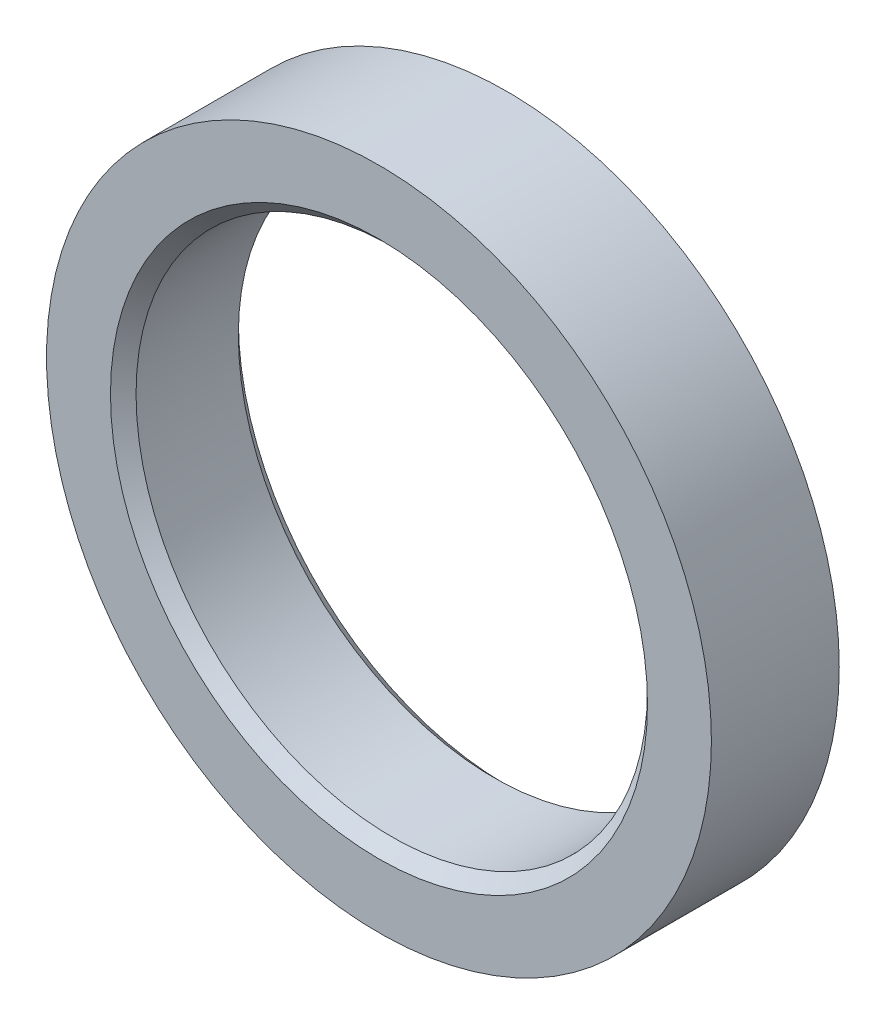
ISO-10303-21;
HEADER;
FILE_DESCRIPTION(('STEP AP214'),'2;1');
FILE_NAME('part.step','',(''),(''),'','','');
FILE_SCHEMA(('AUTOMOTIVE_DESIGN { 1 0 10303 214 1 1 1 1 }'));
ENDSEC;
DATA;
#1=APPLICATION_CONTEXT('core data for automotive mechanical design processes');
#2=APPLICATION_PROTOCOL_DEFINITION('international standard','automotive_design',2000,#1);
#3=PRODUCT_CONTEXT('',#1,'mechanical');
#4=PRODUCT('Part','Part','',(#3));
#5=PRODUCT_RELATED_PRODUCT_CATEGORY('part','',(#4));
#6=PRODUCT_DEFINITION_FORMATION('','',#4);
#7=PRODUCT_DEFINITION_CONTEXT('part definition',#1,'design');
#8=PRODUCT_DEFINITION('design','',#6,#7);
#9=PRODUCT_DEFINITION_SHAPE('','',#8);
#10=(LENGTH_UNIT() NAMED_UNIT(*) SI_UNIT(.MILLI.,.METRE.));
#11=(NAMED_UNIT(*) PLANE_ANGLE_UNIT() SI_UNIT($,.RADIAN.));
#12=(NAMED_UNIT(*) SI_UNIT($,.STERADIAN.) SOLID_ANGLE_UNIT());
#13=UNCERTAINTY_MEASURE_WITH_UNIT(LENGTH_MEASURE(1.E-05),#10,'distance_accuracy_value','');
#14=(GEOMETRIC_REPRESENTATION_CONTEXT(3) GLOBAL_UNCERTAINTY_ASSIGNED_CONTEXT((#13)) GLOBAL_UNIT_ASSIGNED_CONTEXT((#10,
#11,#12)) REPRESENTATION_CONTEXT('',''));
#15=CARTESIAN_POINT('',(0.,0.,0.));
#16=DIRECTION('',(0.,0.,1.));
#17=DIRECTION('',(1.,0.,0.));
#18=AXIS2_PLACEMENT_3D('',#15,#16,#17);
#19=CARTESIAN_POINT('',(0.,0.,5.));
#20=DIRECTION('',(0.,0.,1.));
#21=DIRECTION('',(1.,0.,0.));
#22=AXIS2_PLACEMENT_3D('',#19,#20,#21);
#23=PLANE('',#22);
#24=CARTESIAN_POINT('',(0.,0.,5.));
#25=DIRECTION('',(0.,0.,1.));
#26=DIRECTION('',(1.,0.,0.));
#27=AXIS2_PLACEMENT_3D('',#24,#25,#26);
#28=CIRCLE('',#27,10.5);
#29=CARTESIAN_POINT('',(10.5,0.,5.));
#30=VERTEX_POINT('',#29);
#31=EDGE_CURVE('E10',#30,#30,#28,.F.);
#32=ORIENTED_EDGE('',*,*,#31,.T.);
#33=EDGE_LOOP('',(#32));
#34=FACE_BOUND('',#33,.T.);
#35=CARTESIAN_POINT('',(0.,0.,5.));
#36=DIRECTION('',(0.,0.,1.));
#37=DIRECTION('',(1.,0.,0.));
#38=AXIS2_PLACEMENT_3D('',#35,#36,#37);
#39=CIRCLE('',#38,13.);
#40=CARTESIAN_POINT('',(13.,0.,5.));
#41=VERTEX_POINT('',#40);
#42=EDGE_CURVE('E53',#41,#41,#39,.T.);
#43=ORIENTED_EDGE('',*,*,#42,.T.);
#44=EDGE_LOOP('',(#43));
#45=FACE_BOUND('',#44,.T.);
#46=ADVANCED_FACE('F33',(#34,#45),#23,.T.);
#47=CARTESIAN_POINT('',(0.,0.,0.));
#48=DIRECTION('',(0.,0.,1.));
#49=DIRECTION('',(1.,0.,0.));
#50=AXIS2_PLACEMENT_3D('',#47,#48,#49);
#51=PLANE('',#50);
#52=CARTESIAN_POINT('',(0.,0.,0.));
#53=DIRECTION('',(0.,0.,1.));
#54=DIRECTION('',(1.,0.,0.));
#55=AXIS2_PLACEMENT_3D('',#52,#53,#54);
#56=CIRCLE('',#55,10.5);
#57=CARTESIAN_POINT('',(10.5,0.,0.));
#58=VERTEX_POINT('',#57);
#59=EDGE_CURVE('E48',#58,#58,#56,.T.);
#60=ORIENTED_EDGE('',*,*,#59,.T.);
#61=EDGE_LOOP('',(#60));
#62=FACE_BOUND('',#61,.T.);
#63=CARTESIAN_POINT('',(0.,0.,0.));
#64=DIRECTION('',(0.,0.,1.));
#65=DIRECTION('',(1.,0.,0.));
#66=AXIS2_PLACEMENT_3D('',#63,#64,#65);
#67=CIRCLE('',#66,13.);
#68=CARTESIAN_POINT('',(13.,0.,0.));
#69=VERTEX_POINT('',#68);
#70=EDGE_CURVE('E54',#69,#69,#67,.T.);
#71=ORIENTED_EDGE('',*,*,#70,.F.);
#72=EDGE_LOOP('',(#71));
#73=FACE_BOUND('',#72,.T.);
#74=ADVANCED_FACE('F65',(#62,#73),#51,.F.);
#75=CARTESIAN_POINT('',(0.,0.,5.));
#76=DIRECTION('',(0.,0.,-1.));
#77=DIRECTION('',(-1.,0.,0.));
#78=AXIS2_PLACEMENT_3D('',#75,#76,#77);
#79=CYLINDRICAL_SURFACE('',#78,13.);
#80=ORIENTED_EDGE('',*,*,#42,.F.);
#81=EDGE_LOOP('',(#80));
#82=FACE_BOUND('',#81,.T.);
#83=ORIENTED_EDGE('',*,*,#70,.T.);
#84=EDGE_LOOP('',(#83));
#85=FACE_BOUND('',#84,.T.);
#86=ADVANCED_FACE('F61',(#82,#85),#79,.T.);
#87=CARTESIAN_POINT('',(0.,0.,5.));
#88=DIRECTION('',(0.,0.,-1.));
#89=DIRECTION('',(-1.,0.,0.));
#90=AXIS2_PLACEMENT_3D('',#87,#88,#89);
#91=CYLINDRICAL_SURFACE('',#90,10.);
#92=CARTESIAN_POINT('',(0.,0.,0.499999999999997));
#93=DIRECTION('',(0.,0.,1.));
#94=DIRECTION('',(1.,0.,0.));
#95=AXIS2_PLACEMENT_3D('',#92,#93,#94);
#96=CIRCLE('',#95,10.);
#97=CARTESIAN_POINT('',(10.,0.,0.499999999999997));
#98=VERTEX_POINT('',#97);
#99=EDGE_CURVE('E40',#98,#98,#96,.F.);
#100=ORIENTED_EDGE('',*,*,#99,.T.);
#101=EDGE_LOOP('',(#100));
#102=FACE_BOUND('',#101,.T.);
#103=CARTESIAN_POINT('',(0.,0.,4.5));
#104=DIRECTION('',(0.,0.,1.));
#105=DIRECTION('',(1.,0.,0.));
#106=AXIS2_PLACEMENT_3D('',#103,#104,#105);
#107=CIRCLE('',#106,10.);
#108=CARTESIAN_POINT('',(10.,0.,4.5));
#109=VERTEX_POINT('',#108);
#110=EDGE_CURVE('E44',#109,#109,#107,.T.);
#111=ORIENTED_EDGE('',*,*,#110,.T.);
#112=EDGE_LOOP('',(#111));
#113=FACE_BOUND('',#112,.T.);
#114=ADVANCED_FACE('F64',(#102,#113),#91,.F.);
#115=CARTESIAN_POINT('',(0.,0.,0.));
#116=DIRECTION('',(0.,0.,-1.));
#117=DIRECTION('',(-1.,0.,0.));
#118=AXIS2_PLACEMENT_3D('',#115,#116,#117);
#119=CONICAL_SURFACE('',#118,10.5,0.785398163397448);
#120=ORIENTED_EDGE('',*,*,#99,.F.);
#121=EDGE_LOOP('',(#120));
#122=FACE_BOUND('',#121,.T.);
#123=ORIENTED_EDGE('',*,*,#59,.F.);
#124=EDGE_LOOP('',(#123));
#125=FACE_BOUND('',#124,.T.);
#126=ADVANCED_FACE('F77',(#122,#125),#119,.F.);
#127=CARTESIAN_POINT('',(0.,0.,4.5));
#128=DIRECTION('',(0.,0.,1.));
#129=DIRECTION('',(1.,0.,0.));
#130=AXIS2_PLACEMENT_3D('',#127,#128,#129);
#131=CONICAL_SURFACE('',#130,10.,0.785398163397455);
#132=ORIENTED_EDGE('',*,*,#31,.F.);
#133=EDGE_LOOP('',(#132));
#134=FACE_BOUND('',#133,.T.);
#135=ORIENTED_EDGE('',*,*,#110,.F.);
#136=EDGE_LOOP('',(#135));
#137=FACE_BOUND('',#136,.T.);
#138=ADVANCED_FACE('F35',(#134,#137),#131,.F.);
#139=CLOSED_SHELL('',(#46,#74,#86,#114,#126,#138));
#140=MANIFOLD_SOLID_BREP('B2',#139);
#141=ADVANCED_BREP_SHAPE_REPRESENTATION('',(#18,#140),#14);
#142=SHAPE_DEFINITION_REPRESENTATION(#9,#141);
ENDSEC;
END-ISO-10303-21;
